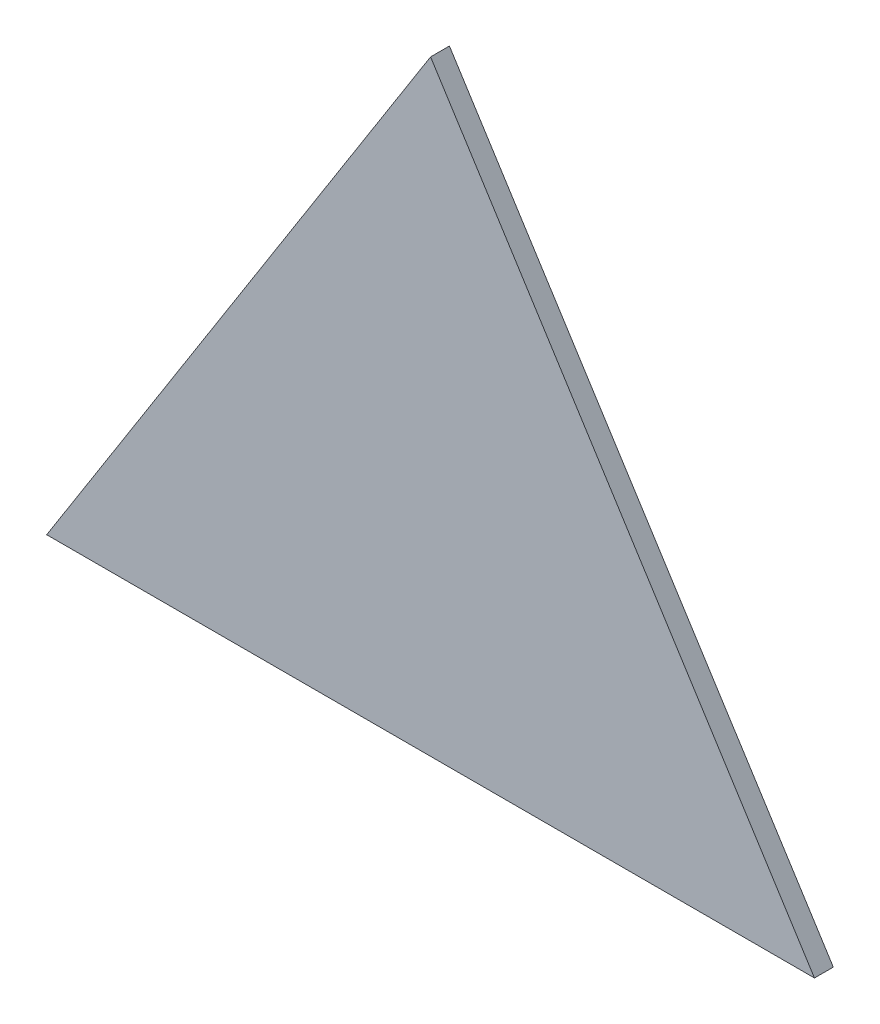
ISO-10303-21;
HEADER;
FILE_DESCRIPTION(('STEP AP214'),'2;1');
FILE_NAME('part.step','',(''),(''),'','','');
FILE_SCHEMA(('AUTOMOTIVE_DESIGN { 1 0 10303 214 1 1 1 1 }'));
ENDSEC;
DATA;
#1=APPLICATION_CONTEXT('core data for automotive mechanical design processes');
#2=APPLICATION_PROTOCOL_DEFINITION('international standard','automotive_design',2000,#1);
#3=PRODUCT_CONTEXT('',#1,'mechanical');
#4=PRODUCT('Part','Part','',(#3));
#5=PRODUCT_RELATED_PRODUCT_CATEGORY('part','',(#4));
#6=PRODUCT_DEFINITION_FORMATION('','',#4);
#7=PRODUCT_DEFINITION_CONTEXT('part definition',#1,'design');
#8=PRODUCT_DEFINITION('design','',#6,#7);
#9=PRODUCT_DEFINITION_SHAPE('','',#8);
#10=(LENGTH_UNIT() NAMED_UNIT(*) SI_UNIT(.MILLI.,.METRE.));
#11=(NAMED_UNIT(*) PLANE_ANGLE_UNIT() SI_UNIT($,.RADIAN.));
#12=(NAMED_UNIT(*) SI_UNIT($,.STERADIAN.) SOLID_ANGLE_UNIT());
#13=UNCERTAINTY_MEASURE_WITH_UNIT(LENGTH_MEASURE(1.E-05),#10,'distance_accuracy_value','');
#14=(GEOMETRIC_REPRESENTATION_CONTEXT(3) GLOBAL_UNCERTAINTY_ASSIGNED_CONTEXT((#13)) GLOBAL_UNIT_ASSIGNED_CONTEXT((#10,
#11,#12)) REPRESENTATION_CONTEXT('',''));
#15=CARTESIAN_POINT('',(0.,0.,0.));
#16=DIRECTION('',(0.,0.,1.));
#17=DIRECTION('',(1.,0.,0.));
#18=AXIS2_PLACEMENT_3D('',#15,#16,#17);
#19=CARTESIAN_POINT('',(194.463340108598,-133.93980957715,0.5));
#20=DIRECTION('',(0.,1.,0.));
#21=DIRECTION('',(0.,0.,1.));
#22=AXIS2_PLACEMENT_3D('',#19,#20,#21);
#23=PLANE('',#22);
#24=DIRECTION('',(1.,0.,0.));
#25=VECTOR('',#24,1.);
#26=CARTESIAN_POINT('',(194.463340108598,-133.93980957715,0.));
#27=LINE('',#26,#25);
#28=CARTESIAN_POINT('',(194.463340108598,-133.93980957715,0.));
#29=VERTEX_POINT('',#28);
#30=CARTESIAN_POINT('',(214.851018799664,-133.93980957715,0.));
#31=VERTEX_POINT('',#30);
#32=EDGE_CURVE('E81',#29,#31,#27,.T.);
#33=ORIENTED_EDGE('',*,*,#32,.T.);
#34=DIRECTION('',(0.,0.,-1.));
#35=VECTOR('',#34,1.);
#36=CARTESIAN_POINT('',(214.851018799664,-133.93980957715,0.5));
#37=LINE('',#36,#35);
#38=CARTESIAN_POINT('',(214.851018799664,-133.93980957715,0.5));
#39=VERTEX_POINT('',#38);
#40=EDGE_CURVE('E11',#39,#31,#37,.T.);
#41=ORIENTED_EDGE('',*,*,#40,.F.);
#42=DIRECTION('',(1.,0.,0.));
#43=VECTOR('',#42,1.);
#44=CARTESIAN_POINT('',(194.463340108598,-133.93980957715,0.5));
#45=LINE('',#44,#43);
#46=CARTESIAN_POINT('',(194.463340108598,-133.93980957715,0.5));
#47=VERTEX_POINT('',#46);
#48=EDGE_CURVE('E74',#47,#39,#45,.T.);
#49=ORIENTED_EDGE('',*,*,#48,.F.);
#50=DIRECTION('',(0.,0.,-1.));
#51=VECTOR('',#50,1.);
#52=CARTESIAN_POINT('',(194.463340108598,-133.93980957715,0.5));
#53=LINE('',#52,#51);
#54=EDGE_CURVE('E82',#47,#29,#53,.T.);
#55=ORIENTED_EDGE('',*,*,#54,.T.);
#56=EDGE_LOOP('',(#33,#41,#49,#55));
#57=FACE_BOUND('',#56,.T.);
#58=ADVANCED_FACE('F34',(#57),#23,.F.);
#59=CARTESIAN_POINT('',(214.851018799664,-133.93980957715,0.5));
#60=DIRECTION('',(-0.844672925694637,-0.535282774427183,0.));
#61=DIRECTION('',(0.535282774427183,-0.844672925694637,0.));
#62=AXIS2_PLACEMENT_3D('',#59,#60,#61);
#63=PLANE('',#62);
#64=DIRECTION('',(-0.535282774427183,0.844672925694637,0.));
#65=VECTOR('',#64,1.);
#66=CARTESIAN_POINT('',(214.851018799664,-133.93980957715,0.));
#67=LINE('',#66,#65);
#68=CARTESIAN_POINT('',(204.657179454131,-117.853993788913,0.));
#69=VERTEX_POINT('',#68);
#70=EDGE_CURVE('E62',#31,#69,#67,.T.);
#71=ORIENTED_EDGE('',*,*,#70,.T.);
#72=DIRECTION('',(0.,0.,-1.));
#73=VECTOR('',#72,1.);
#74=CARTESIAN_POINT('',(204.657179454131,-117.853993788913,0.5));
#75=LINE('',#74,#73);
#76=CARTESIAN_POINT('',(204.657179454131,-117.853993788913,0.5));
#77=VERTEX_POINT('',#76);
#78=EDGE_CURVE('E42',#77,#69,#75,.T.);
#79=ORIENTED_EDGE('',*,*,#78,.F.);
#80=DIRECTION('',(-0.535282774427183,0.844672925694637,0.));
#81=VECTOR('',#80,1.);
#82=CARTESIAN_POINT('',(214.851018799664,-133.93980957715,0.5));
#83=LINE('',#82,#81);
#84=EDGE_CURVE('E70',#39,#77,#83,.T.);
#85=ORIENTED_EDGE('',*,*,#84,.F.);
#86=ORIENTED_EDGE('',*,*,#40,.T.);
#87=EDGE_LOOP('',(#71,#79,#85,#86));
#88=FACE_BOUND('',#87,.T.);
#89=ADVANCED_FACE('F71',(#88),#63,.F.);
#90=CARTESIAN_POINT('',(204.657179454131,-117.853993788913,0.5));
#91=DIRECTION('',(0.844672925694637,-0.535282774427183,0.));
#92=DIRECTION('',(0.535282774427183,0.844672925694637,0.));
#93=AXIS2_PLACEMENT_3D('',#90,#91,#92);
#94=PLANE('',#93);
#95=DIRECTION('',(-0.535282774427183,-0.844672925694637,0.));
#96=VECTOR('',#95,1.);
#97=CARTESIAN_POINT('',(204.657179454131,-117.853993788913,0.));
#98=LINE('',#97,#96);
#99=EDGE_CURVE('E67',#69,#29,#98,.T.);
#100=ORIENTED_EDGE('',*,*,#99,.T.);
#101=ORIENTED_EDGE('',*,*,#54,.F.);
#102=DIRECTION('',(-0.535282774427183,-0.844672925694637,0.));
#103=VECTOR('',#102,1.);
#104=CARTESIAN_POINT('',(204.657179454131,-117.853993788913,0.5));
#105=LINE('',#104,#103);
#106=EDGE_CURVE('E50',#77,#47,#105,.T.);
#107=ORIENTED_EDGE('',*,*,#106,.F.);
#108=ORIENTED_EDGE('',*,*,#78,.T.);
#109=EDGE_LOOP('',(#100,#101,#107,#108));
#110=FACE_BOUND('',#109,.T.);
#111=ADVANCED_FACE('F89',(#110),#94,.F.);
#112=CARTESIAN_POINT('',(0.,0.,0.5));
#113=DIRECTION('',(0.,0.,1.));
#114=DIRECTION('',(1.,0.,0.));
#115=AXIS2_PLACEMENT_3D('',#112,#113,#114);
#116=PLANE('',#115);
#117=ORIENTED_EDGE('',*,*,#48,.T.);
#118=ORIENTED_EDGE('',*,*,#84,.T.);
#119=ORIENTED_EDGE('',*,*,#106,.T.);
#120=EDGE_LOOP('',(#117,#118,#119));
#121=FACE_BOUND('',#120,.T.);
#122=ADVANCED_FACE('F77',(#121),#116,.T.);
#123=CARTESIAN_POINT('',(0.,0.,0.));
#124=DIRECTION('',(0.,0.,1.));
#125=DIRECTION('',(1.,0.,0.));
#126=AXIS2_PLACEMENT_3D('',#123,#124,#125);
#127=PLANE('',#126);
#128=ORIENTED_EDGE('',*,*,#32,.F.);
#129=ORIENTED_EDGE('',*,*,#99,.F.);
#130=ORIENTED_EDGE('',*,*,#70,.F.);
#131=EDGE_LOOP('',(#128,#129,#130));
#132=FACE_BOUND('',#131,.T.);
#133=ADVANCED_FACE('F90',(#132),#127,.F.);
#134=CLOSED_SHELL('',(#58,#89,#111,#122,#133));
#135=MANIFOLD_SOLID_BREP('B2',#134);
#136=ADVANCED_BREP_SHAPE_REPRESENTATION('',(#18,#135),#14);
#137=SHAPE_DEFINITION_REPRESENTATION(#9,#136);
ENDSEC;
END-ISO-10303-21;
